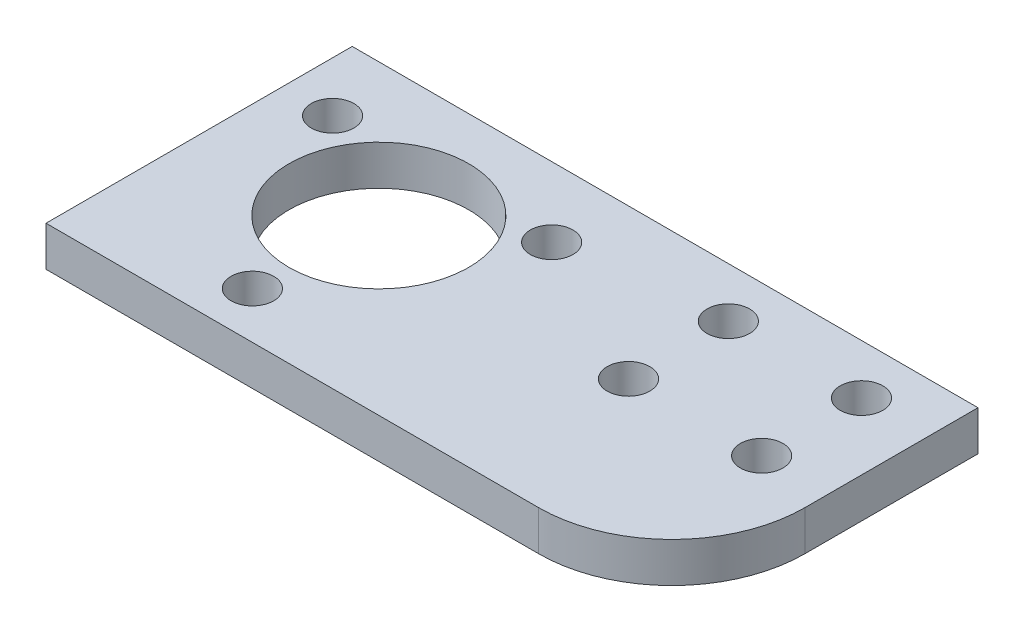
ISO-10303-21;
HEADER;
FILE_DESCRIPTION(('STEP AP214'),'2;1');
FILE_NAME('part.step','',(''),(''),'','','');
FILE_SCHEMA(('AUTOMOTIVE_DESIGN { 1 0 10303 214 1 1 1 1 }'));
ENDSEC;
DATA;
#1=APPLICATION_CONTEXT('core data for automotive mechanical design processes');
#2=APPLICATION_PROTOCOL_DEFINITION('international standard','automotive_design',2000,#1);
#3=PRODUCT_CONTEXT('',#1,'mechanical');
#4=PRODUCT('Part','Part','',(#3));
#5=PRODUCT_RELATED_PRODUCT_CATEGORY('part','',(#4));
#6=PRODUCT_DEFINITION_FORMATION('','',#4);
#7=PRODUCT_DEFINITION_CONTEXT('part definition',#1,'design');
#8=PRODUCT_DEFINITION('design','',#6,#7);
#9=PRODUCT_DEFINITION_SHAPE('','',#8);
#10=(LENGTH_UNIT() NAMED_UNIT(*) SI_UNIT(.MILLI.,.METRE.));
#11=(NAMED_UNIT(*) PLANE_ANGLE_UNIT() SI_UNIT($,.RADIAN.));
#12=(NAMED_UNIT(*) SI_UNIT($,.STERADIAN.) SOLID_ANGLE_UNIT());
#13=UNCERTAINTY_MEASURE_WITH_UNIT(LENGTH_MEASURE(1.E-05),#10,'distance_accuracy_value','');
#14=(GEOMETRIC_REPRESENTATION_CONTEXT(3) GLOBAL_UNCERTAINTY_ASSIGNED_CONTEXT((#13)) GLOBAL_UNIT_ASSIGNED_CONTEXT((#10,
#11,#12)) REPRESENTATION_CONTEXT('',''));
#15=CARTESIAN_POINT('',(0.,0.,0.));
#16=DIRECTION('',(0.,0.,1.));
#17=DIRECTION('',(1.,0.,0.));
#18=AXIS2_PLACEMENT_3D('',#15,#16,#17);
#19=CARTESIAN_POINT('',(23.5,3.,11.5));
#20=DIRECTION('',(-1.,0.,0.));
#21=DIRECTION('',(0.,0.,1.));
#22=AXIS2_PLACEMENT_3D('',#19,#20,#21);
#23=PLANE('',#22);
#24=DIRECTION('',(0.,0.,-1.));
#25=VECTOR('',#24,1.);
#26=CARTESIAN_POINT('',(23.5,3.,11.5));
#27=LINE('',#26,#25);
#28=CARTESIAN_POINT('',(23.5,3.,1.5));
#29=VERTEX_POINT('',#28);
#30=CARTESIAN_POINT('',(23.5,3.,-11.5));
#31=VERTEX_POINT('',#30);
#32=EDGE_CURVE('E91',#29,#31,#27,.T.);
#33=ORIENTED_EDGE('',*,*,#32,.F.);
#34=DIRECTION('',(0.,-1.,0.));
#35=VECTOR('',#34,1.);
#36=CARTESIAN_POINT('',(23.5,3.,1.5));
#37=LINE('',#36,#35);
#38=CARTESIAN_POINT('',(23.5,0.,1.5));
#39=VERTEX_POINT('',#38);
#40=EDGE_CURVE('E117',#29,#39,#37,.T.);
#41=ORIENTED_EDGE('',*,*,#40,.T.);
#42=DIRECTION('',(0.,0.,-1.));
#43=VECTOR('',#42,1.);
#44=CARTESIAN_POINT('',(23.5,0.,11.5));
#45=LINE('',#44,#43);
#46=CARTESIAN_POINT('',(23.5,0.,-11.5));
#47=VERTEX_POINT('',#46);
#48=EDGE_CURVE('E114',#39,#47,#45,.T.);
#49=ORIENTED_EDGE('',*,*,#48,.T.);
#50=DIRECTION('',(0.,-1.,0.));
#51=VECTOR('',#50,1.);
#52=CARTESIAN_POINT('',(23.5,3.,-11.5));
#53=LINE('',#52,#51);
#54=EDGE_CURVE('E107',#31,#47,#53,.T.);
#55=ORIENTED_EDGE('',*,*,#54,.F.);
#56=EDGE_LOOP('',(#33,#41,#49,#55));
#57=FACE_BOUND('',#56,.T.);
#58=ADVANCED_FACE('F44',(#57),#23,.F.);
#59=CARTESIAN_POINT('',(-23.5,3.,-11.5));
#60=DIRECTION('',(0.,0.,1.));
#61=DIRECTION('',(1.,0.,0.));
#62=AXIS2_PLACEMENT_3D('',#59,#60,#61);
#63=PLANE('',#62);
#64=DIRECTION('',(-1.,0.,0.));
#65=VECTOR('',#64,1.);
#66=CARTESIAN_POINT('',(-23.5,0.,-11.5));
#67=LINE('',#66,#65);
#68=CARTESIAN_POINT('',(-23.5,0.,-11.5));
#69=VERTEX_POINT('',#68);
#70=EDGE_CURVE('E137',#47,#69,#67,.T.);
#71=ORIENTED_EDGE('',*,*,#70,.T.);
#72=DIRECTION('',(0.,-1.,0.));
#73=VECTOR('',#72,1.);
#74=CARTESIAN_POINT('',(-23.5,3.,-11.5));
#75=LINE('',#74,#73);
#76=CARTESIAN_POINT('',(-23.5,3.,-11.5));
#77=VERTEX_POINT('',#76);
#78=EDGE_CURVE('E109',#77,#69,#75,.T.);
#79=ORIENTED_EDGE('',*,*,#78,.F.);
#80=DIRECTION('',(-1.,0.,0.));
#81=VECTOR('',#80,1.);
#82=CARTESIAN_POINT('',(-23.5,3.,-11.5));
#83=LINE('',#82,#81);
#84=EDGE_CURVE('E94',#31,#77,#83,.T.);
#85=ORIENTED_EDGE('',*,*,#84,.F.);
#86=ORIENTED_EDGE('',*,*,#54,.T.);
#87=EDGE_LOOP('',(#71,#79,#85,#86));
#88=FACE_BOUND('',#87,.T.);
#89=ADVANCED_FACE('F106',(#88),#63,.F.);
#90=CARTESIAN_POINT('',(-23.5,3.,11.5));
#91=DIRECTION('',(1.,0.,0.));
#92=DIRECTION('',(0.,0.,-1.));
#93=AXIS2_PLACEMENT_3D('',#90,#91,#92);
#94=PLANE('',#93);
#95=DIRECTION('',(0.,0.,1.));
#96=VECTOR('',#95,1.);
#97=CARTESIAN_POINT('',(-23.5,0.,11.5));
#98=LINE('',#97,#96);
#99=CARTESIAN_POINT('',(-23.5,0.,11.5));
#100=VERTEX_POINT('',#99);
#101=EDGE_CURVE('E134',#69,#100,#98,.T.);
#102=ORIENTED_EDGE('',*,*,#101,.T.);
#103=DIRECTION('',(0.,-1.,0.));
#104=VECTOR('',#103,1.);
#105=CARTESIAN_POINT('',(-23.5,3.,11.5));
#106=LINE('',#105,#104);
#107=CARTESIAN_POINT('',(-23.5,3.,11.5));
#108=VERTEX_POINT('',#107);
#109=EDGE_CURVE('E122',#108,#100,#106,.T.);
#110=ORIENTED_EDGE('',*,*,#109,.F.);
#111=DIRECTION('',(0.,0.,1.));
#112=VECTOR('',#111,1.);
#113=CARTESIAN_POINT('',(-23.5,3.,11.5));
#114=LINE('',#113,#112);
#115=EDGE_CURVE('E112',#77,#108,#114,.T.);
#116=ORIENTED_EDGE('',*,*,#115,.F.);
#117=ORIENTED_EDGE('',*,*,#78,.T.);
#118=EDGE_LOOP('',(#102,#110,#116,#117));
#119=FACE_BOUND('',#118,.T.);
#120=ADVANCED_FACE('F249',(#119),#94,.F.);
#121=CARTESIAN_POINT('',(-23.5,3.,11.5));
#122=DIRECTION('',(0.,0.,-1.));
#123=DIRECTION('',(-1.,0.,0.));
#124=AXIS2_PLACEMENT_3D('',#121,#122,#123);
#125=PLANE('',#124);
#126=DIRECTION('',(1.,0.,0.));
#127=VECTOR('',#126,1.);
#128=CARTESIAN_POINT('',(-23.5,0.,11.5));
#129=LINE('',#128,#127);
#130=CARTESIAN_POINT('',(13.5,0.,11.5));
#131=VERTEX_POINT('',#130);
#132=EDGE_CURVE('E102',#100,#131,#129,.T.);
#133=ORIENTED_EDGE('',*,*,#132,.T.);
#134=DIRECTION('',(0.,-1.,0.));
#135=VECTOR('',#134,1.);
#136=CARTESIAN_POINT('',(13.5,3.,11.5));
#137=LINE('',#136,#135);
#138=CARTESIAN_POINT('',(13.5,3.,11.5));
#139=VERTEX_POINT('',#138);
#140=EDGE_CURVE('E53',#131,#139,#137,.F.);
#141=ORIENTED_EDGE('',*,*,#140,.T.);
#142=DIRECTION('',(1.,0.,0.));
#143=VECTOR('',#142,1.);
#144=CARTESIAN_POINT('',(-23.5,3.,11.5));
#145=LINE('',#144,#143);
#146=EDGE_CURVE('E131',#108,#139,#145,.T.);
#147=ORIENTED_EDGE('',*,*,#146,.F.);
#148=ORIENTED_EDGE('',*,*,#109,.T.);
#149=EDGE_LOOP('',(#133,#141,#147,#148));
#150=FACE_BOUND('',#149,.T.);
#151=ADVANCED_FACE('F224',(#150),#125,.F.);
#152=CARTESIAN_POINT('',(0.,3.,0.));
#153=DIRECTION('',(0.,-1.,0.));
#154=DIRECTION('',(0.,0.,-1.));
#155=AXIS2_PLACEMENT_3D('',#152,#153,#154);
#156=PLANE('',#155);
#157=CARTESIAN_POINT('',(18.5,3.,-7.75));
#158=DIRECTION('',(0.,1.,0.));
#159=DIRECTION('',(0.,0.,1.));
#160=AXIS2_PLACEMENT_3D('',#157,#158,#159);
#161=CIRCLE('',#160,1.6);
#162=CARTESIAN_POINT('',(18.5,3.,-6.15));
#163=VERTEX_POINT('',#162);
#164=EDGE_CURVE('E164',#163,#163,#161,.T.);
#165=ORIENTED_EDGE('',*,*,#164,.F.);
#166=EDGE_LOOP('',(#165));
#167=FACE_BOUND('',#166,.T.);
#168=CARTESIAN_POINT('',(8.49999999999998,3.,-0.249999999999999));
#169=DIRECTION('',(0.,1.,0.));
#170=DIRECTION('',(0.,0.,-1.));
#171=AXIS2_PLACEMENT_3D('',#168,#169,#170);
#172=CIRCLE('',#171,1.6);
#173=CARTESIAN_POINT('',(8.49999999999998,3.,-1.85));
#174=VERTEX_POINT('',#173);
#175=EDGE_CURVE('E155',#174,#174,#172,.T.);
#176=ORIENTED_EDGE('',*,*,#175,.F.);
#177=EDGE_LOOP('',(#176));
#178=FACE_BOUND('',#177,.T.);
#179=CARTESIAN_POINT('',(8.49999999999998,3.,-7.75));
#180=DIRECTION('',(0.,1.,0.));
#181=DIRECTION('',(0.,0.,-1.));
#182=AXIS2_PLACEMENT_3D('',#179,#180,#181);
#183=CIRCLE('',#182,1.6);
#184=CARTESIAN_POINT('',(8.49999999999998,3.,-9.35));
#185=VERTEX_POINT('',#184);
#186=EDGE_CURVE('E173',#185,#185,#183,.T.);
#187=ORIENTED_EDGE('',*,*,#186,.F.);
#188=EDGE_LOOP('',(#187));
#189=FACE_BOUND('',#188,.T.);
#190=CARTESIAN_POINT('',(-19.7272413359521,3.,-6.25000000000003));
#191=DIRECTION('',(0.,1.,0.));
#192=DIRECTION('',(0.,0.,1.));
#193=AXIS2_PLACEMENT_3D('',#190,#191,#192);
#194=CIRCLE('',#193,1.60000000000001);
#195=CARTESIAN_POINT('',(-19.7272413359521,3.,-4.65000000000003));
#196=VERTEX_POINT('',#195);
#197=EDGE_CURVE('E189',#196,#196,#194,.T.);
#198=ORIENTED_EDGE('',*,*,#197,.F.);
#199=EDGE_LOOP('',(#198));
#200=FACE_BOUND('',#199,.T.);
#201=CARTESIAN_POINT('',(-11.5,3.,8.));
#202=DIRECTION('',(0.,1.,0.));
#203=DIRECTION('',(0.,0.,1.));
#204=AXIS2_PLACEMENT_3D('',#201,#202,#203);
#205=CIRCLE('',#204,1.6);
#206=CARTESIAN_POINT('',(-11.5,3.,9.6));
#207=VERTEX_POINT('',#206);
#208=EDGE_CURVE('E180',#207,#207,#205,.T.);
#209=ORIENTED_EDGE('',*,*,#208,.F.);
#210=EDGE_LOOP('',(#209));
#211=FACE_BOUND('',#210,.T.);
#212=CARTESIAN_POINT('',(-11.5,3.,-1.5));
#213=DIRECTION('',(0.,1.,0.));
#214=DIRECTION('',(0.,0.,1.));
#215=AXIS2_PLACEMENT_3D('',#212,#213,#214);
#216=CIRCLE('',#215,6.75);
#217=CARTESIAN_POINT('',(-11.5,3.,5.25));
#218=VERTEX_POINT('',#217);
#219=EDGE_CURVE('E172',#218,#218,#216,.T.);
#220=ORIENTED_EDGE('',*,*,#219,.F.);
#221=EDGE_LOOP('',(#220));
#222=FACE_BOUND('',#221,.T.);
#223=CARTESIAN_POINT('',(-3.27275866404785,3.,-6.25000000000004));
#224=DIRECTION('',(0.,1.,0.));
#225=DIRECTION('',(0.,0.,1.));
#226=AXIS2_PLACEMENT_3D('',#223,#224,#225);
#227=CIRCLE('',#226,1.6);
#228=CARTESIAN_POINT('',(-3.27275866404785,3.,-4.65000000000004));
#229=VERTEX_POINT('',#228);
#230=EDGE_CURVE('E196',#229,#229,#227,.T.);
#231=ORIENTED_EDGE('',*,*,#230,.F.);
#232=EDGE_LOOP('',(#231));
#233=FACE_BOUND('',#232,.T.);
#234=CARTESIAN_POINT('',(18.5,3.,-0.249999999999999));
#235=DIRECTION('',(0.,1.,0.));
#236=DIRECTION('',(0.,0.,1.));
#237=AXIS2_PLACEMENT_3D('',#234,#235,#236);
#238=CIRCLE('',#237,1.6);
#239=CARTESIAN_POINT('',(18.5,3.,1.35));
#240=VERTEX_POINT('',#239);
#241=EDGE_CURVE('E147',#240,#240,#238,.T.);
#242=ORIENTED_EDGE('',*,*,#241,.F.);
#243=EDGE_LOOP('',(#242));
#244=FACE_BOUND('',#243,.T.);
#245=ORIENTED_EDGE('',*,*,#146,.T.);
#246=CARTESIAN_POINT('',(13.5,3.,1.5));
#247=DIRECTION('',(0.,-1.,0.));
#248=DIRECTION('',(0.,0.,-1.));
#249=AXIS2_PLACEMENT_3D('',#246,#247,#248);
#250=CIRCLE('',#249,10.);
#251=EDGE_CURVE('E11',#139,#29,#250,.F.);
#252=ORIENTED_EDGE('',*,*,#251,.T.);
#253=ORIENTED_EDGE('',*,*,#32,.T.);
#254=ORIENTED_EDGE('',*,*,#84,.T.);
#255=ORIENTED_EDGE('',*,*,#115,.T.);
#256=EDGE_LOOP('',(#245,#252,#253,#254,#255));
#257=FACE_BOUND('',#256,.T.);
#258=ADVANCED_FACE('F93',(#167,#178,#189,#200,#211,#222,#233,#244,#257),#156,.F.);
#259=CARTESIAN_POINT('',(0.,0.,0.));
#260=DIRECTION('',(0.,-1.,0.));
#261=DIRECTION('',(0.,0.,-1.));
#262=AXIS2_PLACEMENT_3D('',#259,#260,#261);
#263=PLANE('',#262);
#264=CARTESIAN_POINT('',(18.5,0.,-7.75));
#265=DIRECTION('',(0.,1.,0.));
#266=DIRECTION('',(0.,0.,1.));
#267=AXIS2_PLACEMENT_3D('',#264,#265,#266);
#268=CIRCLE('',#267,1.6);
#269=CARTESIAN_POINT('',(18.5,0.,-6.15));
#270=VERTEX_POINT('',#269);
#271=EDGE_CURVE('E168',#270,#270,#268,.T.);
#272=ORIENTED_EDGE('',*,*,#271,.T.);
#273=EDGE_LOOP('',(#272));
#274=FACE_BOUND('',#273,.T.);
#275=CARTESIAN_POINT('',(8.49999999999998,0.,-0.249999999999999));
#276=DIRECTION('',(0.,1.,0.));
#277=DIRECTION('',(0.,0.,-1.));
#278=AXIS2_PLACEMENT_3D('',#275,#276,#277);
#279=CIRCLE('',#278,1.6);
#280=CARTESIAN_POINT('',(8.49999999999998,0.,-1.85));
#281=VERTEX_POINT('',#280);
#282=EDGE_CURVE('E159',#281,#281,#279,.T.);
#283=ORIENTED_EDGE('',*,*,#282,.T.);
#284=EDGE_LOOP('',(#283));
#285=FACE_BOUND('',#284,.T.);
#286=CARTESIAN_POINT('',(8.49999999999998,0.,-7.75));
#287=DIRECTION('',(0.,1.,0.));
#288=DIRECTION('',(0.,0.,-1.));
#289=AXIS2_PLACEMENT_3D('',#286,#287,#288);
#290=CIRCLE('',#289,1.6);
#291=CARTESIAN_POINT('',(8.49999999999998,0.,-9.35));
#292=VERTEX_POINT('',#291);
#293=EDGE_CURVE('E160',#292,#292,#290,.T.);
#294=ORIENTED_EDGE('',*,*,#293,.T.);
#295=EDGE_LOOP('',(#294));
#296=FACE_BOUND('',#295,.T.);
#297=CARTESIAN_POINT('',(-19.7272413359521,0.,-6.25000000000003));
#298=DIRECTION('',(0.,1.,0.));
#299=DIRECTION('',(0.,0.,1.));
#300=AXIS2_PLACEMENT_3D('',#297,#298,#299);
#301=CIRCLE('',#300,1.60000000000001);
#302=CARTESIAN_POINT('',(-19.7272413359521,0.,-4.65000000000003));
#303=VERTEX_POINT('',#302);
#304=EDGE_CURVE('E151',#303,#303,#301,.T.);
#305=ORIENTED_EDGE('',*,*,#304,.T.);
#306=EDGE_LOOP('',(#305));
#307=FACE_BOUND('',#306,.T.);
#308=CARTESIAN_POINT('',(-11.5,0.,8.));
#309=DIRECTION('',(0.,1.,0.));
#310=DIRECTION('',(0.,0.,1.));
#311=AXIS2_PLACEMENT_3D('',#308,#309,#310);
#312=CIRCLE('',#311,1.6);
#313=CARTESIAN_POINT('',(-11.5,0.,9.6));
#314=VERTEX_POINT('',#313);
#315=EDGE_CURVE('E184',#314,#314,#312,.T.);
#316=ORIENTED_EDGE('',*,*,#315,.T.);
#317=EDGE_LOOP('',(#316));
#318=FACE_BOUND('',#317,.T.);
#319=CARTESIAN_POINT('',(-11.5,0.,-1.5));
#320=DIRECTION('',(0.,1.,0.));
#321=DIRECTION('',(0.,0.,1.));
#322=AXIS2_PLACEMENT_3D('',#319,#320,#321);
#323=CIRCLE('',#322,6.75);
#324=CARTESIAN_POINT('',(-11.5,0.,5.25));
#325=VERTEX_POINT('',#324);
#326=EDGE_CURVE('E200',#325,#325,#323,.T.);
#327=ORIENTED_EDGE('',*,*,#326,.T.);
#328=EDGE_LOOP('',(#327));
#329=FACE_BOUND('',#328,.T.);
#330=CARTESIAN_POINT('',(-3.27275866404785,0.,-6.25000000000004));
#331=DIRECTION('',(0.,1.,0.));
#332=DIRECTION('',(0.,0.,1.));
#333=AXIS2_PLACEMENT_3D('',#330,#331,#332);
#334=CIRCLE('',#333,1.6);
#335=CARTESIAN_POINT('',(-3.27275866404785,0.,-4.65000000000004));
#336=VERTEX_POINT('',#335);
#337=EDGE_CURVE('E185',#336,#336,#334,.T.);
#338=ORIENTED_EDGE('',*,*,#337,.T.);
#339=EDGE_LOOP('',(#338));
#340=FACE_BOUND('',#339,.T.);
#341=CARTESIAN_POINT('',(18.5,0.,-0.249999999999999));
#342=DIRECTION('',(0.,1.,0.));
#343=DIRECTION('',(0.,0.,1.));
#344=AXIS2_PLACEMENT_3D('',#341,#342,#343);
#345=CIRCLE('',#344,1.6);
#346=CARTESIAN_POINT('',(18.5,0.,1.35));
#347=VERTEX_POINT('',#346);
#348=EDGE_CURVE('E142',#347,#347,#345,.T.);
#349=ORIENTED_EDGE('',*,*,#348,.T.);
#350=EDGE_LOOP('',(#349));
#351=FACE_BOUND('',#350,.T.);
#352=ORIENTED_EDGE('',*,*,#48,.F.);
#353=CARTESIAN_POINT('',(13.5,0.,1.5));
#354=DIRECTION('',(0.,-1.,0.));
#355=DIRECTION('',(0.,0.,-1.));
#356=AXIS2_PLACEMENT_3D('',#353,#354,#355);
#357=CIRCLE('',#356,10.);
#358=EDGE_CURVE('E67',#39,#131,#357,.T.);
#359=ORIENTED_EDGE('',*,*,#358,.T.);
#360=ORIENTED_EDGE('',*,*,#132,.F.);
#361=ORIENTED_EDGE('',*,*,#101,.F.);
#362=ORIENTED_EDGE('',*,*,#70,.F.);
#363=EDGE_LOOP('',(#352,#359,#360,#361,#362));
#364=FACE_BOUND('',#363,.T.);
#365=ADVANCED_FACE('F211',(#274,#285,#296,#307,#318,#329,#340,#351,#364),#263,.T.);
#366=CARTESIAN_POINT('',(18.5,0.,-0.249999999999999));
#367=DIRECTION('',(0.,1.,0.));
#368=DIRECTION('',(0.,0.,1.));
#369=AXIS2_PLACEMENT_3D('',#366,#367,#368);
#370=CYLINDRICAL_SURFACE('',#369,1.6);
#371=ORIENTED_EDGE('',*,*,#348,.F.);
#372=EDGE_LOOP('',(#371));
#373=FACE_BOUND('',#372,.T.);
#374=ORIENTED_EDGE('',*,*,#241,.T.);
#375=EDGE_LOOP('',(#374));
#376=FACE_BOUND('',#375,.T.);
#377=ADVANCED_FACE('F231',(#373,#376),#370,.F.);
#378=CARTESIAN_POINT('',(-3.27275866404785,0.,-6.25000000000004));
#379=DIRECTION('',(0.,1.,0.));
#380=DIRECTION('',(0.,0.,1.));
#381=AXIS2_PLACEMENT_3D('',#378,#379,#380);
#382=CYLINDRICAL_SURFACE('',#381,1.6);
#383=ORIENTED_EDGE('',*,*,#337,.F.);
#384=EDGE_LOOP('',(#383));
#385=FACE_BOUND('',#384,.T.);
#386=ORIENTED_EDGE('',*,*,#230,.T.);
#387=EDGE_LOOP('',(#386));
#388=FACE_BOUND('',#387,.T.);
#389=ADVANCED_FACE('F218',(#385,#388),#382,.F.);
#390=CARTESIAN_POINT('',(-11.5,0.,-1.5));
#391=DIRECTION('',(0.,1.,0.));
#392=DIRECTION('',(0.,0.,1.));
#393=AXIS2_PLACEMENT_3D('',#390,#391,#392);
#394=CYLINDRICAL_SURFACE('',#393,6.75);
#395=ORIENTED_EDGE('',*,*,#326,.F.);
#396=EDGE_LOOP('',(#395));
#397=FACE_BOUND('',#396,.T.);
#398=ORIENTED_EDGE('',*,*,#219,.T.);
#399=EDGE_LOOP('',(#398));
#400=FACE_BOUND('',#399,.T.);
#401=ADVANCED_FACE('F214',(#397,#400),#394,.F.);
#402=CARTESIAN_POINT('',(-11.5,0.,8.));
#403=DIRECTION('',(0.,1.,0.));
#404=DIRECTION('',(0.,0.,1.));
#405=AXIS2_PLACEMENT_3D('',#402,#403,#404);
#406=CYLINDRICAL_SURFACE('',#405,1.6);
#407=ORIENTED_EDGE('',*,*,#315,.F.);
#408=EDGE_LOOP('',(#407));
#409=FACE_BOUND('',#408,.T.);
#410=ORIENTED_EDGE('',*,*,#208,.T.);
#411=EDGE_LOOP('',(#410));
#412=FACE_BOUND('',#411,.T.);
#413=ADVANCED_FACE('F217',(#409,#412),#406,.F.);
#414=CARTESIAN_POINT('',(-19.7272413359521,0.,-6.25000000000003));
#415=DIRECTION('',(0.,1.,0.));
#416=DIRECTION('',(0.,0.,1.));
#417=AXIS2_PLACEMENT_3D('',#414,#415,#416);
#418=CYLINDRICAL_SURFACE('',#417,1.60000000000001);
#419=ORIENTED_EDGE('',*,*,#304,.F.);
#420=EDGE_LOOP('',(#419));
#421=FACE_BOUND('',#420,.T.);
#422=ORIENTED_EDGE('',*,*,#197,.T.);
#423=EDGE_LOOP('',(#422));
#424=FACE_BOUND('',#423,.T.);
#425=ADVANCED_FACE('F279',(#421,#424),#418,.F.);
#426=CARTESIAN_POINT('',(8.49999999999998,0.,-7.75));
#427=DIRECTION('',(0.,1.,0.));
#428=DIRECTION('',(0.,0.,1.));
#429=AXIS2_PLACEMENT_3D('',#426,#427,#428);
#430=CYLINDRICAL_SURFACE('',#429,1.6);
#431=ORIENTED_EDGE('',*,*,#293,.F.);
#432=EDGE_LOOP('',(#431));
#433=FACE_BOUND('',#432,.T.);
#434=ORIENTED_EDGE('',*,*,#186,.T.);
#435=EDGE_LOOP('',(#434));
#436=FACE_BOUND('',#435,.T.);
#437=ADVANCED_FACE('F272',(#433,#436),#430,.F.);
#438=CARTESIAN_POINT('',(8.49999999999998,0.,-0.249999999999999));
#439=DIRECTION('',(0.,1.,0.));
#440=DIRECTION('',(0.,0.,1.));
#441=AXIS2_PLACEMENT_3D('',#438,#439,#440);
#442=CYLINDRICAL_SURFACE('',#441,1.6);
#443=ORIENTED_EDGE('',*,*,#282,.F.);
#444=EDGE_LOOP('',(#443));
#445=FACE_BOUND('',#444,.T.);
#446=ORIENTED_EDGE('',*,*,#175,.T.);
#447=EDGE_LOOP('',(#446));
#448=FACE_BOUND('',#447,.T.);
#449=ADVANCED_FACE('F266',(#445,#448),#442,.F.);
#450=CARTESIAN_POINT('',(18.5,0.,-7.75));
#451=DIRECTION('',(0.,1.,0.));
#452=DIRECTION('',(0.,0.,1.));
#453=AXIS2_PLACEMENT_3D('',#450,#451,#452);
#454=CYLINDRICAL_SURFACE('',#453,1.6);
#455=ORIENTED_EDGE('',*,*,#271,.F.);
#456=EDGE_LOOP('',(#455));
#457=FACE_BOUND('',#456,.T.);
#458=ORIENTED_EDGE('',*,*,#164,.T.);
#459=EDGE_LOOP('',(#458));
#460=FACE_BOUND('',#459,.T.);
#461=ADVANCED_FACE('F262',(#457,#460),#454,.F.);
#462=CARTESIAN_POINT('',(13.5,3.,1.5));
#463=DIRECTION('',(0.,-1.,0.));
#464=DIRECTION('',(0.,0.,-1.));
#465=AXIS2_PLACEMENT_3D('',#462,#463,#464);
#466=CYLINDRICAL_SURFACE('',#465,10.);
#467=ORIENTED_EDGE('',*,*,#251,.F.);
#468=ORIENTED_EDGE('',*,*,#140,.F.);
#469=ORIENTED_EDGE('',*,*,#358,.F.);
#470=ORIENTED_EDGE('',*,*,#40,.F.);
#471=EDGE_LOOP('',(#467,#468,#469,#470));
#472=FACE_BOUND('',#471,.T.);
#473=ADVANCED_FACE('F46',(#472),#466,.T.);
#474=CLOSED_SHELL('',(#58,#89,#120,#151,#258,#365,#377,#389,#401,#413,#425,#437,#449,#461,#473));
#475=MANIFOLD_SOLID_BREP('B2',#474);
#476=ADVANCED_BREP_SHAPE_REPRESENTATION('',(#18,#475),#14);
#477=SHAPE_DEFINITION_REPRESENTATION(#9,#476);
ENDSEC;
END-ISO-10303-21;
